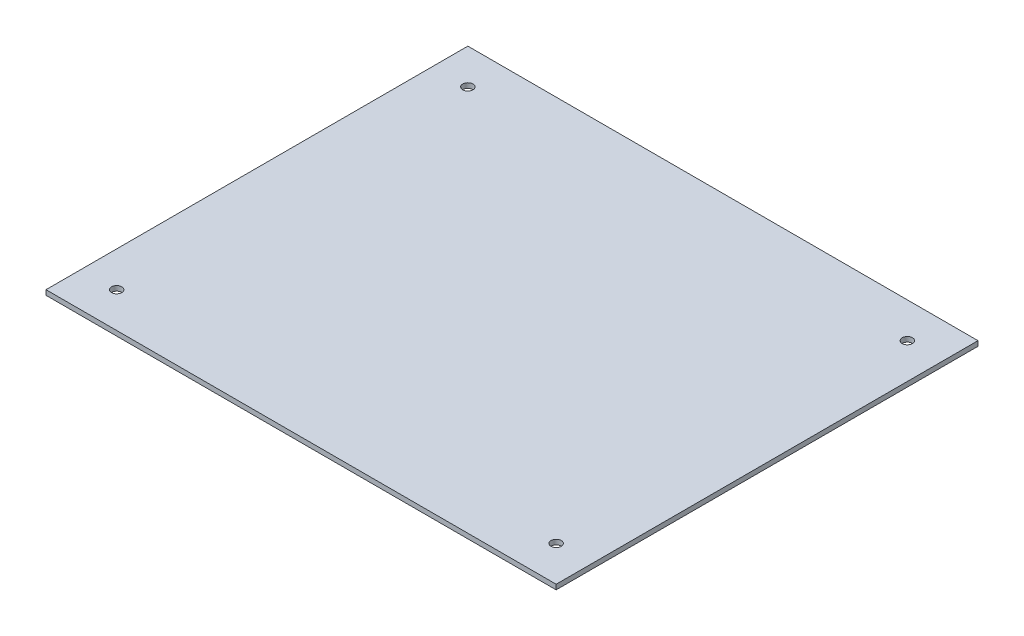
ISO-10303-21;
HEADER;
FILE_DESCRIPTION(('STEP AP214'),'2;1');
FILE_NAME('part.step','',(''),(''),'','','');
FILE_SCHEMA(('AUTOMOTIVE_DESIGN { 1 0 10303 214 1 1 1 1 }'));
ENDSEC;
DATA;
#1=APPLICATION_CONTEXT('core data for automotive mechanical design processes');
#2=APPLICATION_PROTOCOL_DEFINITION('international standard','automotive_design',2000,#1);
#3=PRODUCT_CONTEXT('',#1,'mechanical');
#4=PRODUCT('Part','Part','',(#3));
#5=PRODUCT_RELATED_PRODUCT_CATEGORY('part','',(#4));
#6=PRODUCT_DEFINITION_FORMATION('','',#4);
#7=PRODUCT_DEFINITION_CONTEXT('part definition',#1,'design');
#8=PRODUCT_DEFINITION('design','',#6,#7);
#9=PRODUCT_DEFINITION_SHAPE('','',#8);
#10=(LENGTH_UNIT() NAMED_UNIT(*) SI_UNIT(.MILLI.,.METRE.));
#11=(NAMED_UNIT(*) PLANE_ANGLE_UNIT() SI_UNIT($,.RADIAN.));
#12=(NAMED_UNIT(*) SI_UNIT($,.STERADIAN.) SOLID_ANGLE_UNIT());
#13=UNCERTAINTY_MEASURE_WITH_UNIT(LENGTH_MEASURE(1.E-05),#10,'distance_accuracy_value','');
#14=(GEOMETRIC_REPRESENTATION_CONTEXT(3) GLOBAL_UNCERTAINTY_ASSIGNED_CONTEXT((#13)) GLOBAL_UNIT_ASSIGNED_CONTEXT((#10,
#11,#12)) REPRESENTATION_CONTEXT('',''));
#15=CARTESIAN_POINT('',(0.,0.,0.));
#16=DIRECTION('',(0.,0.,1.));
#17=DIRECTION('',(1.,0.,0.));
#18=AXIS2_PLACEMENT_3D('',#15,#16,#17);
#19=CARTESIAN_POINT('',(165.1,3.175,-136.525));
#20=DIRECTION('',(-1.,0.,0.));
#21=DIRECTION('',(0.,0.,1.));
#22=AXIS2_PLACEMENT_3D('',#19,#20,#21);
#23=PLANE('',#22);
#24=DIRECTION('',(0.,0.,-1.));
#25=VECTOR('',#24,1.);
#26=CARTESIAN_POINT('',(165.1,0.,-136.525));
#27=LINE('',#26,#25);
#28=CARTESIAN_POINT('',(165.1,0.,136.525));
#29=VERTEX_POINT('',#28);
#30=CARTESIAN_POINT('',(165.1,0.,-136.525));
#31=VERTEX_POINT('',#30);
#32=EDGE_CURVE('E96',#29,#31,#27,.T.);
#33=ORIENTED_EDGE('',*,*,#32,.T.);
#34=DIRECTION('',(0.,-1.,0.));
#35=VECTOR('',#34,1.);
#36=CARTESIAN_POINT('',(165.1,3.175,-136.525));
#37=LINE('',#36,#35);
#38=CARTESIAN_POINT('',(165.1,3.175,-136.525));
#39=VERTEX_POINT('',#38);
#40=EDGE_CURVE('E11',#39,#31,#37,.T.);
#41=ORIENTED_EDGE('',*,*,#40,.F.);
#42=DIRECTION('',(0.,0.,-1.));
#43=VECTOR('',#42,1.);
#44=CARTESIAN_POINT('',(165.1,3.175,-136.525));
#45=LINE('',#44,#43);
#46=CARTESIAN_POINT('',(165.1,3.175,136.525));
#47=VERTEX_POINT('',#46);
#48=EDGE_CURVE('E84',#47,#39,#45,.T.);
#49=ORIENTED_EDGE('',*,*,#48,.F.);
#50=DIRECTION('',(0.,-1.,0.));
#51=VECTOR('',#50,1.);
#52=CARTESIAN_POINT('',(165.1,3.175,136.525));
#53=LINE('',#52,#51);
#54=EDGE_CURVE('E92',#47,#29,#53,.T.);
#55=ORIENTED_EDGE('',*,*,#54,.T.);
#56=EDGE_LOOP('',(#33,#41,#49,#55));
#57=FACE_BOUND('',#56,.T.);
#58=ADVANCED_FACE('F33',(#57),#23,.F.);
#59=CARTESIAN_POINT('',(-165.1,3.175,-136.525));
#60=DIRECTION('',(0.,0.,1.));
#61=DIRECTION('',(1.,0.,0.));
#62=AXIS2_PLACEMENT_3D('',#59,#60,#61);
#63=PLANE('',#62);
#64=DIRECTION('',(-1.,0.,0.));
#65=VECTOR('',#64,1.);
#66=CARTESIAN_POINT('',(-165.1,0.,-136.525));
#67=LINE('',#66,#65);
#68=CARTESIAN_POINT('',(-165.1,0.,-136.525));
#69=VERTEX_POINT('',#68);
#70=EDGE_CURVE('E88',#31,#69,#67,.T.);
#71=ORIENTED_EDGE('',*,*,#70,.T.);
#72=DIRECTION('',(0.,-1.,0.));
#73=VECTOR('',#72,1.);
#74=CARTESIAN_POINT('',(-165.1,3.175,-136.525));
#75=LINE('',#74,#73);
#76=CARTESIAN_POINT('',(-165.1,3.175,-136.525));
#77=VERTEX_POINT('',#76);
#78=EDGE_CURVE('E41',#77,#69,#75,.T.);
#79=ORIENTED_EDGE('',*,*,#78,.F.);
#80=DIRECTION('',(-1.,0.,0.));
#81=VECTOR('',#80,1.);
#82=CARTESIAN_POINT('',(-165.1,3.175,-136.525));
#83=LINE('',#82,#81);
#84=EDGE_CURVE('E79',#39,#77,#83,.T.);
#85=ORIENTED_EDGE('',*,*,#84,.F.);
#86=ORIENTED_EDGE('',*,*,#40,.T.);
#87=EDGE_LOOP('',(#71,#79,#85,#86));
#88=FACE_BOUND('',#87,.T.);
#89=ADVANCED_FACE('F87',(#88),#63,.F.);
#90=CARTESIAN_POINT('',(-165.1,3.175,-136.525));
#91=DIRECTION('',(1.,0.,0.));
#92=DIRECTION('',(0.,0.,-1.));
#93=AXIS2_PLACEMENT_3D('',#90,#91,#92);
#94=PLANE('',#93);
#95=DIRECTION('',(0.,0.,1.));
#96=VECTOR('',#95,1.);
#97=CARTESIAN_POINT('',(-165.1,0.,-136.525));
#98=LINE('',#97,#96);
#99=CARTESIAN_POINT('',(-165.1,0.,136.525));
#100=VERTEX_POINT('',#99);
#101=EDGE_CURVE('E66',#69,#100,#98,.T.);
#102=ORIENTED_EDGE('',*,*,#101,.T.);
#103=DIRECTION('',(0.,-1.,0.));
#104=VECTOR('',#103,1.);
#105=CARTESIAN_POINT('',(-165.1,3.175,136.525));
#106=LINE('',#105,#104);
#107=CARTESIAN_POINT('',(-165.1,3.175,136.525));
#108=VERTEX_POINT('',#107);
#109=EDGE_CURVE('E89',#108,#100,#106,.T.);
#110=ORIENTED_EDGE('',*,*,#109,.F.);
#111=DIRECTION('',(0.,0.,1.));
#112=VECTOR('',#111,1.);
#113=CARTESIAN_POINT('',(-165.1,3.175,-136.525));
#114=LINE('',#113,#112);
#115=EDGE_CURVE('E82',#77,#108,#114,.T.);
#116=ORIENTED_EDGE('',*,*,#115,.F.);
#117=ORIENTED_EDGE('',*,*,#78,.T.);
#118=EDGE_LOOP('',(#102,#110,#116,#117));
#119=FACE_BOUND('',#118,.T.);
#120=ADVANCED_FACE('F90',(#119),#94,.F.);
#121=CARTESIAN_POINT('',(-165.1,3.175,136.525));
#122=DIRECTION('',(0.,0.,-1.));
#123=DIRECTION('',(-1.,0.,0.));
#124=AXIS2_PLACEMENT_3D('',#121,#122,#123);
#125=PLANE('',#124);
#126=DIRECTION('',(1.,0.,0.));
#127=VECTOR('',#126,1.);
#128=CARTESIAN_POINT('',(-165.1,0.,136.525));
#129=LINE('',#128,#127);
#130=EDGE_CURVE('E72',#100,#29,#129,.T.);
#131=ORIENTED_EDGE('',*,*,#130,.T.);
#132=ORIENTED_EDGE('',*,*,#54,.F.);
#133=DIRECTION('',(1.,0.,0.));
#134=VECTOR('',#133,1.);
#135=CARTESIAN_POINT('',(-165.1,3.175,136.525));
#136=LINE('',#135,#134);
#137=EDGE_CURVE('E49',#108,#47,#136,.T.);
#138=ORIENTED_EDGE('',*,*,#137,.F.);
#139=ORIENTED_EDGE('',*,*,#109,.T.);
#140=EDGE_LOOP('',(#131,#132,#138,#139));
#141=FACE_BOUND('',#140,.T.);
#142=ADVANCED_FACE('F104',(#141),#125,.F.);
#143=CARTESIAN_POINT('',(0.,3.175,0.));
#144=DIRECTION('',(0.,1.,0.));
#145=DIRECTION('',(0.,0.,1.));
#146=AXIS2_PLACEMENT_3D('',#143,#144,#145);
#147=PLANE('',#146);
#148=CARTESIAN_POINT('',(-142.24,3.175,-113.665));
#149=DIRECTION('',(0.,1.,0.));
#150=DIRECTION('',(0.,0.,1.));
#151=AXIS2_PLACEMENT_3D('',#148,#149,#150);
#152=CIRCLE('',#151,3.30200000000004);
#153=CARTESIAN_POINT('',(-142.24,3.175,-110.363));
#154=VERTEX_POINT('',#153);
#155=EDGE_CURVE('E128',#154,#154,#152,.T.);
#156=ORIENTED_EDGE('',*,*,#155,.F.);
#157=EDGE_LOOP('',(#156));
#158=FACE_BOUND('',#157,.T.);
#159=CARTESIAN_POINT('',(142.24,3.175,113.665));
#160=DIRECTION('',(0.,1.,0.));
#161=DIRECTION('',(0.,0.,1.));
#162=AXIS2_PLACEMENT_3D('',#159,#160,#161);
#163=CIRCLE('',#162,3.30200000000004);
#164=CARTESIAN_POINT('',(142.24,3.175,116.967));
#165=VERTEX_POINT('',#164);
#166=EDGE_CURVE('E122',#165,#165,#163,.T.);
#167=ORIENTED_EDGE('',*,*,#166,.F.);
#168=EDGE_LOOP('',(#167));
#169=FACE_BOUND('',#168,.T.);
#170=CARTESIAN_POINT('',(142.24,3.175,-113.665));
#171=DIRECTION('',(0.,1.,0.));
#172=DIRECTION('',(0.,0.,1.));
#173=AXIS2_PLACEMENT_3D('',#170,#171,#172);
#174=CIRCLE('',#173,3.30200000000004);
#175=CARTESIAN_POINT('',(142.24,3.175,-110.363));
#176=VERTEX_POINT('',#175);
#177=EDGE_CURVE('E116',#176,#176,#174,.T.);
#178=ORIENTED_EDGE('',*,*,#177,.F.);
#179=EDGE_LOOP('',(#178));
#180=FACE_BOUND('',#179,.T.);
#181=CARTESIAN_POINT('',(-142.24,3.175,113.665));
#182=DIRECTION('',(0.,1.,0.));
#183=DIRECTION('',(0.,0.,1.));
#184=AXIS2_PLACEMENT_3D('',#181,#182,#183);
#185=CIRCLE('',#184,3.30200000000004);
#186=CARTESIAN_POINT('',(-142.24,3.175,116.967));
#187=VERTEX_POINT('',#186);
#188=EDGE_CURVE('E110',#187,#187,#185,.T.);
#189=ORIENTED_EDGE('',*,*,#188,.F.);
#190=EDGE_LOOP('',(#189));
#191=FACE_BOUND('',#190,.T.);
#192=ORIENTED_EDGE('',*,*,#48,.T.);
#193=ORIENTED_EDGE('',*,*,#84,.T.);
#194=ORIENTED_EDGE('',*,*,#115,.T.);
#195=ORIENTED_EDGE('',*,*,#137,.T.);
#196=EDGE_LOOP('',(#192,#193,#194,#195));
#197=FACE_BOUND('',#196,.T.);
#198=ADVANCED_FACE('F80',(#158,#169,#180,#191,#197),#147,.T.);
#199=CARTESIAN_POINT('',(0.,0.,0.));
#200=DIRECTION('',(0.,1.,0.));
#201=DIRECTION('',(0.,0.,1.));
#202=AXIS2_PLACEMENT_3D('',#199,#200,#201);
#203=PLANE('',#202);
#204=CARTESIAN_POINT('',(-142.24,0.,-113.665));
#205=DIRECTION('',(0.,1.,0.));
#206=DIRECTION('',(0.,0.,1.));
#207=AXIS2_PLACEMENT_3D('',#204,#205,#206);
#208=CIRCLE('',#207,3.30200000000004);
#209=CARTESIAN_POINT('',(-142.24,0.,-110.363));
#210=VERTEX_POINT('',#209);
#211=EDGE_CURVE('E113',#210,#210,#208,.T.);
#212=ORIENTED_EDGE('',*,*,#211,.T.);
#213=EDGE_LOOP('',(#212));
#214=FACE_BOUND('',#213,.T.);
#215=CARTESIAN_POINT('',(142.24,0.,113.665));
#216=DIRECTION('',(0.,1.,0.));
#217=DIRECTION('',(0.,0.,1.));
#218=AXIS2_PLACEMENT_3D('',#215,#216,#217);
#219=CIRCLE('',#218,3.30200000000004);
#220=CARTESIAN_POINT('',(142.24,0.,116.967));
#221=VERTEX_POINT('',#220);
#222=EDGE_CURVE('E125',#221,#221,#219,.T.);
#223=ORIENTED_EDGE('',*,*,#222,.T.);
#224=EDGE_LOOP('',(#223));
#225=FACE_BOUND('',#224,.T.);
#226=CARTESIAN_POINT('',(142.24,0.,-113.665));
#227=DIRECTION('',(0.,1.,0.));
#228=DIRECTION('',(0.,0.,1.));
#229=AXIS2_PLACEMENT_3D('',#226,#227,#228);
#230=CIRCLE('',#229,3.30200000000004);
#231=CARTESIAN_POINT('',(142.24,0.,-110.363));
#232=VERTEX_POINT('',#231);
#233=EDGE_CURVE('E119',#232,#232,#230,.T.);
#234=ORIENTED_EDGE('',*,*,#233,.T.);
#235=EDGE_LOOP('',(#234));
#236=FACE_BOUND('',#235,.T.);
#237=CARTESIAN_POINT('',(-142.24,0.,113.665));
#238=DIRECTION('',(0.,1.,0.));
#239=DIRECTION('',(0.,0.,1.));
#240=AXIS2_PLACEMENT_3D('',#237,#238,#239);
#241=CIRCLE('',#240,3.30200000000004);
#242=CARTESIAN_POINT('',(-142.24,0.,116.967));
#243=VERTEX_POINT('',#242);
#244=EDGE_CURVE('E99',#243,#243,#241,.T.);
#245=ORIENTED_EDGE('',*,*,#244,.T.);
#246=EDGE_LOOP('',(#245));
#247=FACE_BOUND('',#246,.T.);
#248=ORIENTED_EDGE('',*,*,#32,.F.);
#249=ORIENTED_EDGE('',*,*,#130,.F.);
#250=ORIENTED_EDGE('',*,*,#101,.F.);
#251=ORIENTED_EDGE('',*,*,#70,.F.);
#252=EDGE_LOOP('',(#248,#249,#250,#251));
#253=FACE_BOUND('',#252,.T.);
#254=ADVANCED_FACE('F107',(#214,#225,#236,#247,#253),#203,.F.);
#255=CARTESIAN_POINT('',(-142.24,0.,113.665));
#256=DIRECTION('',(0.,1.,0.));
#257=DIRECTION('',(0.,0.,1.));
#258=AXIS2_PLACEMENT_3D('',#255,#256,#257);
#259=CYLINDRICAL_SURFACE('',#258,3.30200000000004);
#260=ORIENTED_EDGE('',*,*,#244,.F.);
#261=EDGE_LOOP('',(#260));
#262=FACE_BOUND('',#261,.T.);
#263=ORIENTED_EDGE('',*,*,#188,.T.);
#264=EDGE_LOOP('',(#263));
#265=FACE_BOUND('',#264,.T.);
#266=ADVANCED_FACE('F152',(#262,#265),#259,.F.);
#267=CARTESIAN_POINT('',(142.24,0.,-113.665));
#268=DIRECTION('',(0.,1.,0.));
#269=DIRECTION('',(0.,0.,1.));
#270=AXIS2_PLACEMENT_3D('',#267,#268,#269);
#271=CYLINDRICAL_SURFACE('',#270,3.30200000000004);
#272=ORIENTED_EDGE('',*,*,#233,.F.);
#273=EDGE_LOOP('',(#272));
#274=FACE_BOUND('',#273,.T.);
#275=ORIENTED_EDGE('',*,*,#177,.T.);
#276=EDGE_LOOP('',(#275));
#277=FACE_BOUND('',#276,.T.);
#278=ADVANCED_FACE('F154',(#274,#277),#271,.F.);
#279=CARTESIAN_POINT('',(142.24,0.,113.665));
#280=DIRECTION('',(0.,1.,0.));
#281=DIRECTION('',(0.,0.,1.));
#282=AXIS2_PLACEMENT_3D('',#279,#280,#281);
#283=CYLINDRICAL_SURFACE('',#282,3.30200000000004);
#284=ORIENTED_EDGE('',*,*,#222,.F.);
#285=EDGE_LOOP('',(#284));
#286=FACE_BOUND('',#285,.T.);
#287=ORIENTED_EDGE('',*,*,#166,.T.);
#288=EDGE_LOOP('',(#287));
#289=FACE_BOUND('',#288,.T.);
#290=ADVANCED_FACE('F139',(#286,#289),#283,.F.);
#291=CARTESIAN_POINT('',(-142.24,0.,-113.665));
#292=DIRECTION('',(0.,1.,0.));
#293=DIRECTION('',(0.,0.,1.));
#294=AXIS2_PLACEMENT_3D('',#291,#292,#293);
#295=CYLINDRICAL_SURFACE('',#294,3.30200000000004);
#296=ORIENTED_EDGE('',*,*,#211,.F.);
#297=EDGE_LOOP('',(#296));
#298=FACE_BOUND('',#297,.T.);
#299=ORIENTED_EDGE('',*,*,#155,.T.);
#300=EDGE_LOOP('',(#299));
#301=FACE_BOUND('',#300,.T.);
#302=ADVANCED_FACE('F136',(#298,#301),#295,.F.);
#303=CLOSED_SHELL('',(#58,#89,#120,#142,#198,#254,#266,#278,#290,#302));
#304=MANIFOLD_SOLID_BREP('B2',#303);
#305=ADVANCED_BREP_SHAPE_REPRESENTATION('',(#18,#304),#14);
#306=SHAPE_DEFINITION_REPRESENTATION(#9,#305);
ENDSEC;
END-ISO-10303-21;
